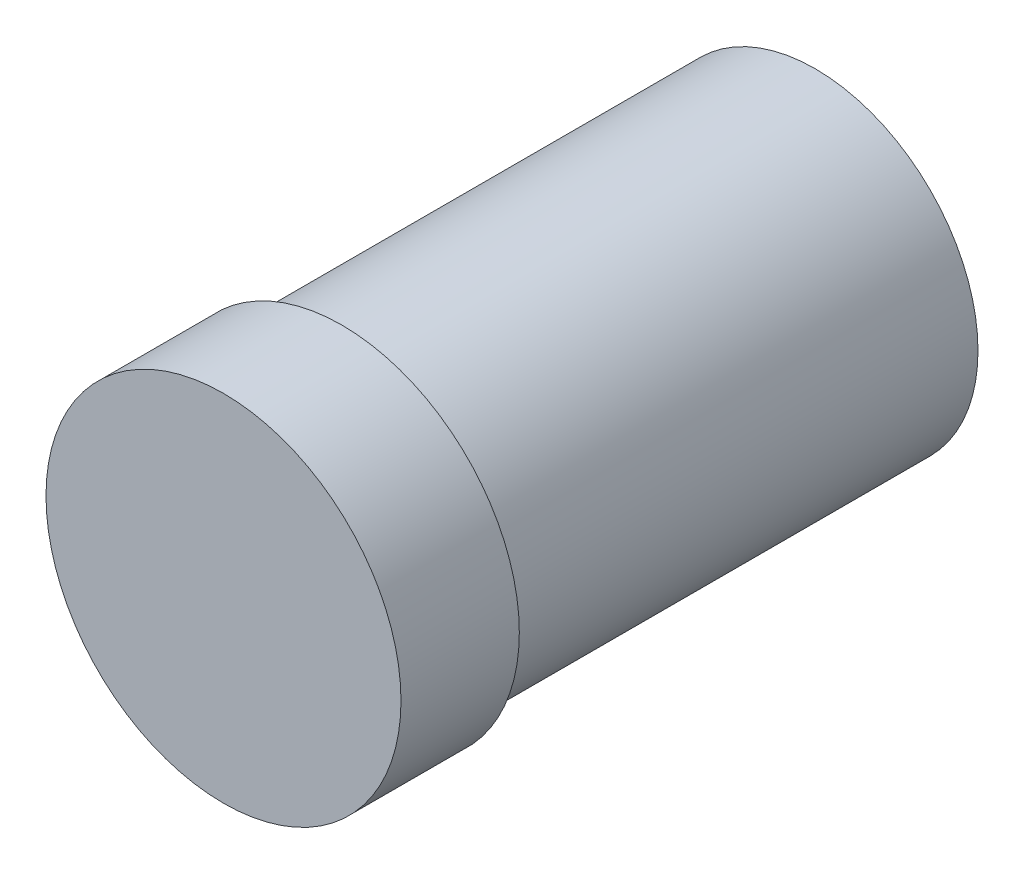
ISO-10303-21;
HEADER;
FILE_DESCRIPTION(('STEP AP214'),'2;1');
FILE_NAME('part.step','',(''),(''),'','','');
FILE_SCHEMA(('AUTOMOTIVE_DESIGN { 1 0 10303 214 1 1 1 1 }'));
ENDSEC;
DATA;
#1=APPLICATION_CONTEXT('core data for automotive mechanical design processes');
#2=APPLICATION_PROTOCOL_DEFINITION('international standard','automotive_design',2000,#1);
#3=PRODUCT_CONTEXT('',#1,'mechanical');
#4=PRODUCT('Part','Part','',(#3));
#5=PRODUCT_RELATED_PRODUCT_CATEGORY('part','',(#4));
#6=PRODUCT_DEFINITION_FORMATION('','',#4);
#7=PRODUCT_DEFINITION_CONTEXT('part definition',#1,'design');
#8=PRODUCT_DEFINITION('design','',#6,#7);
#9=PRODUCT_DEFINITION_SHAPE('','',#8);
#10=(LENGTH_UNIT() NAMED_UNIT(*) SI_UNIT(.MILLI.,.METRE.));
#11=(NAMED_UNIT(*) PLANE_ANGLE_UNIT() SI_UNIT($,.RADIAN.));
#12=(NAMED_UNIT(*) SI_UNIT($,.STERADIAN.) SOLID_ANGLE_UNIT());
#13=UNCERTAINTY_MEASURE_WITH_UNIT(LENGTH_MEASURE(1.E-05),#10,'distance_accuracy_value','');
#14=(GEOMETRIC_REPRESENTATION_CONTEXT(3) GLOBAL_UNCERTAINTY_ASSIGNED_CONTEXT((#13)) GLOBAL_UNIT_ASSIGNED_CONTEXT((#10,
#11,#12)) REPRESENTATION_CONTEXT('',''));
#15=CARTESIAN_POINT('',(0.,0.,0.));
#16=DIRECTION('',(0.,0.,1.));
#17=DIRECTION('',(1.,0.,0.));
#18=AXIS2_PLACEMENT_3D('',#15,#16,#17);
#19=CARTESIAN_POINT('',(-183.,-76.,281.5));
#20=DIRECTION('',(0.,0.,1.));
#21=DIRECTION('',(1.,0.,0.));
#22=AXIS2_PLACEMENT_3D('',#19,#20,#21);
#23=PLANE('',#22);
#24=CARTESIAN_POINT('',(-183.,-76.,281.5));
#25=DIRECTION('',(0.,0.,1.));
#26=DIRECTION('',(1.,0.,0.));
#27=AXIS2_PLACEMENT_3D('',#24,#25,#26);
#28=CIRCLE('',#27,12.);
#29=CARTESIAN_POINT('',(-171.,-76.,281.5));
#30=VERTEX_POINT('',#29);
#31=EDGE_CURVE('P0_E10',#30,#30,#28,.T.);
#32=ORIENTED_EDGE('',*,*,#31,.F.);
#33=EDGE_LOOP('',(#32));
#34=FACE_BOUND('',#33,.T.);
#35=ADVANCED_FACE('P0_F15',(#34),#23,.F.);
#36=CARTESIAN_POINT('',(-183.,-76.,289.5));
#37=DIRECTION('',(0.,0.,1.));
#38=DIRECTION('',(1.,0.,0.));
#39=AXIS2_PLACEMENT_3D('',#36,#37,#38);
#40=PLANE('',#39);
#41=CARTESIAN_POINT('',(-183.,-76.,289.5));
#42=DIRECTION('',(0.,0.,1.));
#43=DIRECTION('',(1.,0.,0.));
#44=AXIS2_PLACEMENT_3D('',#41,#42,#43);
#45=CIRCLE('',#44,12.);
#46=CARTESIAN_POINT('',(-171.,-76.,289.5));
#47=VERTEX_POINT('',#46);
#48=EDGE_CURVE('P0_E39',#47,#47,#45,.T.);
#49=ORIENTED_EDGE('',*,*,#48,.T.);
#50=EDGE_LOOP('',(#49));
#51=FACE_BOUND('',#50,.T.);
#52=ADVANCED_FACE('P0_F42',(#51),#40,.T.);
#53=CARTESIAN_POINT('',(-183.,-76.,281.5));
#54=DIRECTION('',(0.,0.,1.));
#55=DIRECTION('',(1.,0.,0.));
#56=AXIS2_PLACEMENT_3D('',#53,#54,#55);
#57=CYLINDRICAL_SURFACE('',#56,12.);
#58=ORIENTED_EDGE('',*,*,#48,.F.);
#59=DIRECTION('',(0.,0.,1.));
#60=VECTOR('',#59,1.);
#61=CARTESIAN_POINT('',(-171.,-76.,281.5));
#62=LINE('',#61,#60);
#63=EDGE_CURVE('P0_E24',#30,#47,#62,.T.);
#64=ORIENTED_EDGE('',*,*,#63,.F.);
#65=ORIENTED_EDGE('',*,*,#31,.T.);
#66=ORIENTED_EDGE('',*,*,#63,.T.);
#67=EDGE_LOOP('',(#58,#64,#65,#66));
#68=FACE_BOUND('',#67,.T.);
#69=ADVANCED_FACE('P0_F38',(#68),#57,.T.);
#70=CLOSED_SHELL('',(#35,#52,#69));
#71=MANIFOLD_SOLID_BREP('P0_B1',#70);
#72=CARTESIAN_POINT('',(-183.,-76.,249.49));
#73=DIRECTION('',(0.,0.,1.));
#74=DIRECTION('',(1.,0.,0.));
#75=AXIS2_PLACEMENT_3D('',#72,#73,#74);
#76=PLANE('',#75);
#77=CARTESIAN_POINT('',(-183.,-76.,249.49));
#78=DIRECTION('',(0.,0.,1.));
#79=DIRECTION('',(1.,0.,0.));
#80=AXIS2_PLACEMENT_3D('',#77,#78,#79);
#81=CIRCLE('',#80,11.);
#82=CARTESIAN_POINT('',(-172.,-76.,249.49));
#83=VERTEX_POINT('',#82);
#84=EDGE_CURVE('P1_E10',#83,#83,#81,.T.);
#85=ORIENTED_EDGE('',*,*,#84,.F.);
#86=EDGE_LOOP('',(#85));
#87=FACE_BOUND('',#86,.T.);
#88=ADVANCED_FACE('P1_F15',(#87),#76,.F.);
#89=CARTESIAN_POINT('',(-183.,-76.,281.49));
#90=DIRECTION('',(0.,0.,1.));
#91=DIRECTION('',(1.,0.,0.));
#92=AXIS2_PLACEMENT_3D('',#89,#90,#91);
#93=PLANE('',#92);
#94=CARTESIAN_POINT('',(-183.,-76.,281.49));
#95=DIRECTION('',(0.,0.,1.));
#96=DIRECTION('',(1.,0.,0.));
#97=AXIS2_PLACEMENT_3D('',#94,#95,#96);
#98=CIRCLE('',#97,11.);
#99=CARTESIAN_POINT('',(-172.,-76.,281.49));
#100=VERTEX_POINT('',#99);
#101=EDGE_CURVE('P1_E40',#100,#100,#98,.T.);
#102=ORIENTED_EDGE('',*,*,#101,.T.);
#103=EDGE_LOOP('',(#102));
#104=FACE_BOUND('',#103,.T.);
#105=ADVANCED_FACE('P1_F43',(#104),#93,.T.);
#106=CARTESIAN_POINT('',(-183.,-76.,249.49));
#107=DIRECTION('',(0.,0.,1.));
#108=DIRECTION('',(1.,0.,0.));
#109=AXIS2_PLACEMENT_3D('',#106,#107,#108);
#110=CYLINDRICAL_SURFACE('',#109,11.);
#111=ORIENTED_EDGE('',*,*,#101,.F.);
#112=DIRECTION('',(0.,0.,1.));
#113=VECTOR('',#112,1.);
#114=CARTESIAN_POINT('',(-172.,-76.,249.49));
#115=LINE('',#114,#113);
#116=EDGE_CURVE('P1_E18',#83,#100,#115,.T.);
#117=ORIENTED_EDGE('',*,*,#116,.F.);
#118=ORIENTED_EDGE('',*,*,#84,.T.);
#119=ORIENTED_EDGE('',*,*,#116,.T.);
#120=EDGE_LOOP('',(#111,#117,#118,#119));
#121=FACE_BOUND('',#120,.T.);
#122=ADVANCED_FACE('P1_F39',(#121),#110,.T.);
#123=CLOSED_SHELL('',(#88,#105,#122));
#124=MANIFOLD_SOLID_BREP('P1_B1',#123);
#125=ADVANCED_BREP_SHAPE_REPRESENTATION('',(#18,#71,#124),#14);
#126=SHAPE_DEFINITION_REPRESENTATION(#9,#125);
ENDSEC;
END-ISO-10303-21;
